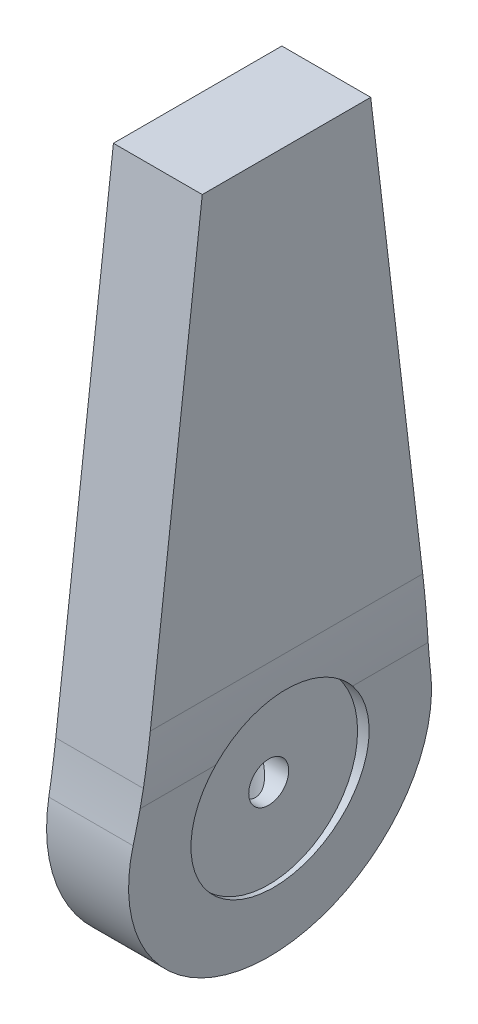
ISO-10303-21;
HEADER;
FILE_DESCRIPTION(('STEP AP214'),'2;1');
FILE_NAME('part.step','',(''),(''),'','','');
FILE_SCHEMA(('AUTOMOTIVE_DESIGN { 1 0 10303 214 1 1 1 1 }'));
ENDSEC;
DATA;
#1=APPLICATION_CONTEXT('core data for automotive mechanical design processes');
#2=APPLICATION_PROTOCOL_DEFINITION('international standard','automotive_design',2000,#1);
#3=PRODUCT_CONTEXT('',#1,'mechanical');
#4=PRODUCT('Part','Part','',(#3));
#5=PRODUCT_RELATED_PRODUCT_CATEGORY('part','',(#4));
#6=PRODUCT_DEFINITION_FORMATION('','',#4);
#7=PRODUCT_DEFINITION_CONTEXT('part definition',#1,'design');
#8=PRODUCT_DEFINITION('design','',#6,#7);
#9=PRODUCT_DEFINITION_SHAPE('','',#8);
#10=(LENGTH_UNIT() NAMED_UNIT(*) SI_UNIT(.MILLI.,.METRE.));
#11=(NAMED_UNIT(*) PLANE_ANGLE_UNIT() SI_UNIT($,.RADIAN.));
#12=(NAMED_UNIT(*) SI_UNIT($,.STERADIAN.) SOLID_ANGLE_UNIT());
#13=UNCERTAINTY_MEASURE_WITH_UNIT(LENGTH_MEASURE(1.E-05),#10,'distance_accuracy_value','');
#14=(GEOMETRIC_REPRESENTATION_CONTEXT(3) GLOBAL_UNCERTAINTY_ASSIGNED_CONTEXT((#13)) GLOBAL_UNIT_ASSIGNED_CONTEXT((#10,
#11,#12)) REPRESENTATION_CONTEXT('',''));
#15=CARTESIAN_POINT('',(0.,0.,0.));
#16=DIRECTION('',(0.,0.,1.));
#17=DIRECTION('',(1.,0.,0.));
#18=AXIS2_PLACEMENT_3D('',#15,#16,#17);
#19=CARTESIAN_POINT('',(-6.,-19.,0.));
#20=DIRECTION('',(0.,1.,0.));
#21=DIRECTION('',(0.,0.,1.));
#22=AXIS2_PLACEMENT_3D('',#19,#20,#21);
#23=CYLINDRICAL_SURFACE('',#22,2.5);
#24=CARTESIAN_POINT('',(-6.,-16.8151717208002,2.5));
#25=CARTESIAN_POINT('',(-6.13960906148192,-16.8151740185166,2.49999421020369));
#26=CARTESIAN_POINT('',(-6.27929995486534,-16.8169291988967,2.48826605121617));
#27=CARTESIAN_POINT('',(-6.55477842002669,-16.8237557916967,2.44167444753415));
#28=CARTESIAN_POINT('',(-6.69056201272335,-16.8288304679333,2.40678823272198));
#29=CARTESIAN_POINT('',(-6.95419839191177,-16.8417091295973,2.31494484226469));
#30=CARTESIAN_POINT('',(-7.08205709076528,-16.8495110507939,2.25800435581721));
#31=CARTESIAN_POINT('',(-7.3263864039983,-16.8669626686957,2.12370763056537));
#32=CARTESIAN_POINT('',(-7.44285863076834,-16.8766121032081,2.04635428809548));
#33=CARTESIAN_POINT('',(-7.66202434302888,-16.8967545847397,1.87279136125536));
#34=CARTESIAN_POINT('',(-7.76461744487372,-16.907252982425,1.77645562325415));
#35=CARTESIAN_POINT('',(-7.95224310302877,-16.9278626867034,1.56793485448318));
#36=CARTESIAN_POINT('',(-8.03727470583522,-16.9379739722539,1.45574896368403));
#37=CARTESIAN_POINT('',(-8.18773282906593,-16.9567260318457,1.2180707254503));
#38=CARTESIAN_POINT('',(-8.25306709238781,-16.9653598065303,1.09251937696103));
#39=CARTESIAN_POINT('',(-8.36168403912427,-16.9801248418252,0.832077202708479));
#40=CARTESIAN_POINT('',(-8.40496784342736,-16.9862562296358,0.697186852069652));
#41=CARTESIAN_POINT('',(-8.46795140200924,-16.995287909029,0.42292879699046));
#42=CARTESIAN_POINT('',(-8.48781913020422,-16.998211203127,0.283600437619453));
#43=CARTESIAN_POINT('',(-8.50392800954728,-17.0005761209487,0.00355891361205861));
#44=CARTESIAN_POINT('',(-8.50017042550937,-17.0000179310585,-0.137154176488152));
#45=CARTESIAN_POINT('',(-8.46926816315222,-16.9955011819606,-0.414825218535945));
#46=CARTESIAN_POINT('',(-8.44230419034891,-16.9915688971587,-0.551803769365082));
#47=CARTESIAN_POINT('',(-8.36603806027492,-16.9807750785218,-0.819270554274912));
#48=CARTESIAN_POINT('',(-8.31673534633206,-16.9739134716895,-0.949758626525637));
#49=CARTESIAN_POINT('',(-8.19700535761945,-16.9579867877463,-1.20108890904549));
#50=CARTESIAN_POINT('',(-8.12650174049244,-16.9489137703188,-1.32189422731169));
#51=CARTESIAN_POINT('',(-7.96642699469264,-16.9295759486806,-1.55002749324877));
#52=CARTESIAN_POINT('',(-7.8768546589482,-16.9193110690425,-1.65735458704856));
#53=CARTESIAN_POINT('',(-7.68017773851109,-16.8986202553189,-1.85654954239533));
#54=CARTESIAN_POINT('',(-7.57291541627695,-16.8881937160666,-1.94826166688123));
#55=CARTESIAN_POINT('',(-7.34443997041283,-16.8684495185282,-2.11240792664068));
#56=CARTESIAN_POINT('',(-7.22322676707911,-16.859131866578,-2.18484195176736));
#57=CARTESIAN_POINT('',(-6.97013102156376,-16.8426606437894,-2.30839536879655));
#58=CARTESIAN_POINT('',(-6.8382407747377,-16.8355086536737,-2.35949920197702));
#59=CARTESIAN_POINT('',(-6.56762086270222,-16.8242068379837,-2.43878726891991));
#60=CARTESIAN_POINT('',(-6.42889166055572,-16.8200568094451,-2.46697305219971));
#61=CARTESIAN_POINT('',(-6.149916176808,-16.8152671334742,-2.49941227314397));
#62=CARTESIAN_POINT('',(-6.00969607833697,-16.814595135128,-2.50388627546157));
#63=CARTESIAN_POINT('',(-5.73050810360339,-16.8167517589942,-2.48935977625441));
#64=CARTESIAN_POINT('',(-5.59154019016967,-16.8195802769464,-2.47035997387838));
#65=CARTESIAN_POINT('',(-5.31948185145494,-16.8283895386062,-2.4096120992047));
#66=CARTESIAN_POINT('',(-5.18636644275136,-16.8343551051417,-2.36797352162805));
#67=CARTESIAN_POINT('',(-4.92900467584743,-16.8487538078346,-2.2632438107387));
#68=CARTESIAN_POINT('',(-4.80475874029866,-16.8571870614857,-2.20015165593633));
#69=CARTESIAN_POINT('',(-4.56767291247191,-16.8756473049567,-2.05377424781224));
#70=CARTESIAN_POINT('',(-4.4549221974269,-16.8856854008258,-1.97034597978972));
#71=CARTESIAN_POINT('',(-4.24494324890917,-16.9061906654832,-1.78586380241483));
#72=CARTESIAN_POINT('',(-4.14771585857667,-16.9166578575388,-1.68480893630752));
#73=CARTESIAN_POINT('',(-3.97075356290693,-16.9369428195476,-1.46697176425955));
#74=CARTESIAN_POINT('',(-3.89116467429606,-16.9467547304722,-1.35007021425899));
#75=CARTESIAN_POINT('',(-3.75275504515444,-16.9645329982163,-1.10442863265448));
#76=CARTESIAN_POINT('',(-3.69393375457015,-16.9724994039141,-0.975688914711766));
#77=CARTESIAN_POINT('',(-3.59896334561044,-16.9856633523498,-0.71048502448538));
#78=CARTESIAN_POINT('',(-3.56273381717819,-16.9908707052188,-0.574050154778879));
#79=CARTESIAN_POINT('',(-3.51371493953207,-16.9979709468246,-0.296951082333415));
#80=CARTESIAN_POINT('',(-3.50092410489109,-16.999864045602,-0.1562871481857));
#81=CARTESIAN_POINT('',(-3.4991808769464,-17.0001205154926,0.123859733675883));
#82=CARTESIAN_POINT('',(-3.51000485162686,-16.9985169995871,0.263341311253438));
#83=CARTESIAN_POINT('',(-3.55470536808957,-16.9920270563139,0.538478359641031));
#84=CARTESIAN_POINT('',(-3.58858184436487,-16.9871406382752,0.67413384132232));
#85=CARTESIAN_POINT('',(-3.67834751559762,-16.9746313659072,0.937710544112775));
#86=CARTESIAN_POINT('',(-3.73422182052181,-16.9670103628902,1.06563692952141));
#87=CARTESIAN_POINT('',(-3.8663733542916,-16.9498698418753,1.31033385823192));
#88=CARTESIAN_POINT('',(-3.94265119358986,-16.9403502670763,1.42710406761065));
#89=CARTESIAN_POINT('',(-4.11425567496283,-16.9203641851463,1.64730939293222));
#90=CARTESIAN_POINT('',(-4.20974762724334,-16.9098899245386,1.75061499142791));
#91=CARTESIAN_POINT('',(-4.41672202128241,-16.8892329493587,1.93981763467728));
#92=CARTESIAN_POINT('',(-4.52820821371111,-16.8790503038444,2.0257105847098));
#93=CARTESIAN_POINT('',(-4.76471097908521,-16.8600707018513,2.17806321212975));
#94=CARTESIAN_POINT('',(-4.88979720701376,-16.8512815058354,2.24441570637191));
#95=CARTESIAN_POINT('',(-5.14940744936069,-16.8361748874922,2.35507140477779));
#96=CARTESIAN_POINT('',(-5.28392144107317,-16.8298548857848,2.39939763135067));
#97=CARTESIAN_POINT('',(-5.51587650215886,-16.8218718995573,2.45461211651069));
#98=CARTESIAN_POINT('',(-5.61188075286216,-16.8193725499681,2.47160673271683));
#99=CARTESIAN_POINT('',(-5.80524340379117,-16.8160216691373,2.49430262522055));
#100=CARTESIAN_POINT('',(-5.90260178748737,-16.8151701177992,2.50000403924935));
#101=CARTESIAN_POINT('',(-6.,-16.8151717208002,2.5));
#102=B_SPLINE_CURVE_WITH_KNOTS('',3,(#24,#25,#26,#27,#28,#29,#30,#31,#32,#33,#34,#35,#36,#37,
#38,#39,#40,#41,#42,#43,#44,#45,#46,#47,#48,#49,#50,#51,#52,#53,#54,#55,#56,#57,#58,#59,#60,#61,
#62,#63,#64,#65,#66,#67,#68,#69,#70,#71,#72,#73,#74,#75,#76,#77,#78,#79,#80,#81,#82,#83,#84,#85,
#86,#87,#88,#89,#90,#91,#92,#93,#94,#95,#96,#97,#98,#99,#100,#101),.UNSPECIFIED.,.T.,.F.,(4,2,2,
2,2,2,2,2,2,2,2,2,2,2,2,2,2,2,2,2,2,2,2,2,2,2,2,2,2,2,2,2,2,2,2,2,2,2,4),(0.,0.41847120810007,
0.837354487946605,1.25592140230922,1.67442895905137,2.09581782748951,2.51722956927747,
2.94058547780217,3.36391986377584,3.78419863489791,4.2044549060018,4.62146799605351,
5.03849147847009,5.45703497874756,5.87560498118832,6.29813197177102,6.72066137644184,
7.14349844722328,7.56630692709534,7.98517549166614,8.40403158086854,8.82087962186062,
9.23774751341641,9.65763620555363,10.0775476959446,10.5008152660655,10.9240716246206,
11.3458127718726,11.7675271903565,12.1852653255138,12.6030022736141,13.0204569460215,
13.4379241096387,13.8591496464984,14.2804741232455,14.7040683476293,15.1272188844489,
15.4191687358398,15.7111150266056),.UNSPECIFIED.);
#103=CARTESIAN_POINT('',(-6.,-16.8151717208002,2.5));
#104=VERTEX_POINT('',#103);
#105=EDGE_CURVE('E176',#104,#104,#102,.T.);
#106=ORIENTED_EDGE('',*,*,#105,.T.);
#107=EDGE_LOOP('',(#106));
#108=FACE_BOUND('',#107,.T.);
#109=CARTESIAN_POINT('',(-6.,-16.,0.));
#110=DIRECTION('',(0.,1.,0.));
#111=DIRECTION('',(0.,0.,1.));
#112=AXIS2_PLACEMENT_3D('',#109,#110,#111);
#113=CIRCLE('',#112,2.5);
#114=CARTESIAN_POINT('',(-6.,-16.,2.5));
#115=VERTEX_POINT('',#114);
#116=EDGE_CURVE('E51',#115,#115,#113,.F.);
#117=ORIENTED_EDGE('',*,*,#116,.F.);
#118=EDGE_LOOP('',(#117));
#119=FACE_BOUND('',#118,.T.);
#120=ADVANCED_FACE('F46',(#108,#119),#23,.F.);
#121=CARTESIAN_POINT('',(-10.,20.0618159527067,-115.267183277287));
#122=DIRECTION('',(1.,0.,0.));
#123=DIRECTION('',(0.,0.,-1.));
#124=AXIS2_PLACEMENT_3D('',#121,#122,#123);
#125=CYLINDRICAL_SURFACE('',#124,100.);
#126=DIRECTION('',(1.,0.,0.));
#127=VECTOR('',#126,1.);
#128=CARTESIAN_POINT('',(-10.,8.29110353174055,-15.9623479010433));
#129=LINE('',#128,#127);
#130=CARTESIAN_POINT('',(-10.,8.29110353174055,-15.9623479010433));
#131=VERTEX_POINT('',#130);
#132=CARTESIAN_POINT('',(-0.142704621186115,8.29110353174055,-15.9623479010433));
#133=VERTEX_POINT('',#132);
#134=EDGE_CURVE('E279',#131,#133,#129,.T.);
#135=ORIENTED_EDGE('',*,*,#134,.T.);
#136=CARTESIAN_POINT('',(-0.14270462118611,8.29110353174055,-15.9623479010433));
#137=CARTESIAN_POINT('',(-0.159792062425878,7.9716698806926,-16.0002126418456));
#138=CARTESIAN_POINT('',(-0.17839525662364,7.65252762071868,-16.0396028367243));
#139=CARTESIAN_POINT('',(-0.218633150935153,7.01482588291889,-16.1214341346341));
#140=CARTESIAN_POINT('',(-0.240267851048904,6.69626640509302,-16.1638752376652));
#141=CARTESIAN_POINT('',(-0.263418304120649,6.37799831834119,-16.2078417947727));
#142=B_SPLINE_CURVE_WITH_KNOTS('',3,(#136,#137,#138,#139,#140,#141),.UNSPECIFIED.,.F.,.F.,(4,2,
4),(0.,0.96630483569823,1.93260967139648),.UNSPECIFIED.);
#143=CARTESIAN_POINT('',(-0.263418304120647,6.37799831834123,-16.2078417947726));
#144=VERTEX_POINT('',#143);
#145=EDGE_CURVE('E75',#133,#144,#142,.T.);
#146=ORIENTED_EDGE('',*,*,#145,.T.);
#147=CARTESIAN_POINT('',(0.731768432924124,20.0618159527067,-115.267183277287));
#148=DIRECTION('',(0.997365816958794,-0.0725356957788214,0.));
#149=DIRECTION('',(0.0725356957788214,0.997365816958794,0.));
#150=AXIS2_PLACEMENT_3D('',#147,#148,#149);
#151=ELLIPSE('',#150,100.264114028816,100.);
#152=CARTESIAN_POINT('',(-0.515275293739853,2.91496471107704,-16.7482232112298));
#153=VERTEX_POINT('',#152);
#154=EDGE_CURVE('E245',#144,#153,#151,.T.);
#155=ORIENTED_EDGE('',*,*,#154,.T.);
#156=DIRECTION('',(1.,0.,0.));
#157=VECTOR('',#156,1.);
#158=CARTESIAN_POINT('',(-10.,2.91496471107704,-16.7482232112298));
#159=LINE('',#158,#157);
#160=CARTESIAN_POINT('',(-10.,2.91496471107704,-16.7482232112298));
#161=VERTEX_POINT('',#160);
#162=EDGE_CURVE('E275',#161,#153,#159,.T.);
#163=ORIENTED_EDGE('',*,*,#162,.F.);
#164=CARTESIAN_POINT('',(-10.,20.0618159527067,-115.267183277287));
#165=DIRECTION('',(-1.,0.,0.));
#166=DIRECTION('',(0.,0.,1.));
#167=AXIS2_PLACEMENT_3D('',#164,#165,#166);
#168=CIRCLE('',#167,100.);
#169=EDGE_CURVE('E301',#161,#131,#168,.T.);
#170=ORIENTED_EDGE('',*,*,#169,.T.);
#171=EDGE_LOOP('',(#135,#146,#155,#163,#170));
#172=FACE_BOUND('',#171,.T.);
#173=ADVANCED_FACE('F48',(#172),#125,.F.);
#174=CARTESIAN_POINT('',(-10.,0.,0.));
#175=DIRECTION('',(1.,0.,0.));
#176=DIRECTION('',(0.,0.,-1.));
#177=AXIS2_PLACEMENT_3D('',#174,#175,#176);
#178=CYLINDRICAL_SURFACE('',#177,17.);
#179=ORIENTED_EDGE('',*,*,#105,.F.);
#180=EDGE_LOOP('',(#179));
#181=FACE_BOUND('',#180,.T.);
#182=CARTESIAN_POINT('',(-10.,0.,0.));
#183=DIRECTION('',(1.,0.,0.));
#184=DIRECTION('',(0.,0.,-1.));
#185=AXIS2_PLACEMENT_3D('',#182,#183,#184);
#186=CIRCLE('',#185,17.);
#187=CARTESIAN_POINT('',(-10.,2.91496471107704,16.7482232112298));
#188=VERTEX_POINT('',#187);
#189=EDGE_CURVE('E283',#188,#161,#186,.T.);
#190=ORIENTED_EDGE('',*,*,#189,.T.);
#191=ORIENTED_EDGE('',*,*,#162,.T.);
#192=CARTESIAN_POINT('',(-0.727272727272727,0.,0.));
#193=DIRECTION('',(0.997365816958794,-0.0725356957788214,0.));
#194=DIRECTION('',(0.0725356957788214,0.997365816958794,0.));
#195=AXIS2_PLACEMENT_3D('',#192,#193,#194);
#196=ELLIPSE('',#195,17.0448993848988,17.);
#197=CARTESIAN_POINT('',(-0.515275293739851,2.91496471107704,16.7482232112298));
#198=VERTEX_POINT('',#197);
#199=EDGE_CURVE('E246',#153,#198,#196,.F.);
#200=ORIENTED_EDGE('',*,*,#199,.T.);
#201=DIRECTION('',(1.,0.,0.));
#202=VECTOR('',#201,1.);
#203=CARTESIAN_POINT('',(-10.,2.91496471107704,16.7482232112298));
#204=LINE('',#203,#202);
#205=EDGE_CURVE('E273',#188,#198,#204,.T.);
#206=ORIENTED_EDGE('',*,*,#205,.F.);
#207=EDGE_LOOP('',(#190,#191,#200,#206));
#208=FACE_BOUND('',#207,.T.);
#209=ADVANCED_FACE('F189',(#181,#208),#178,.T.);
#210=CARTESIAN_POINT('',(-10.,20.0618159527067,115.267183277287));
#211=DIRECTION('',(1.,0.,0.));
#212=DIRECTION('',(0.,0.,-1.));
#213=AXIS2_PLACEMENT_3D('',#210,#211,#212);
#214=CYLINDRICAL_SURFACE('',#213,100.);
#215=CARTESIAN_POINT('',(0.731768432924124,20.0618159527067,115.267183277287));
#216=DIRECTION('',(0.997365816958794,-0.0725356957788214,0.));
#217=DIRECTION('',(0.0725356957788214,0.997365816958794,0.));
#218=AXIS2_PLACEMENT_3D('',#215,#216,#217);
#219=ELLIPSE('',#218,100.264114028816,100.);
#220=CARTESIAN_POINT('',(-0.263418304120647,6.37799831834123,16.2078417947726));
#221=VERTEX_POINT('',#220);
#222=EDGE_CURVE('E248',#198,#221,#219,.T.);
#223=ORIENTED_EDGE('',*,*,#222,.T.);
#224=CARTESIAN_POINT('',(-0.263418304120647,6.37799831834119,16.2078417947727));
#225=CARTESIAN_POINT('',(-0.240267851048906,6.69626640509291,16.1638752376652));
#226=CARTESIAN_POINT('',(-0.21863315093516,7.01482588291867,16.1214341346341));
#227=CARTESIAN_POINT('',(-0.178395256623656,7.65252762071824,16.0396028367243));
#228=CARTESIAN_POINT('',(-0.159792062425899,7.97166988069205,16.0002126418457));
#229=CARTESIAN_POINT('',(-0.142704621186135,8.2911035317399,15.9623479010433));
#230=B_SPLINE_CURVE_WITH_KNOTS('',3,(#224,#225,#226,#227,#228,#229),.UNSPECIFIED.,.F.,.F.,(4,2,
4),(0.,0.966304835697922,1.93260967139582),.UNSPECIFIED.);
#231=CARTESIAN_POINT('',(-0.142704621186143,8.2911035317399,15.9623479010433));
#232=VERTEX_POINT('',#231);
#233=EDGE_CURVE('E202',#221,#232,#230,.T.);
#234=ORIENTED_EDGE('',*,*,#233,.T.);
#235=DIRECTION('',(1.,0.,0.));
#236=VECTOR('',#235,1.);
#237=CARTESIAN_POINT('',(-10.,8.2911035317399,15.9623479010433));
#238=LINE('',#237,#236);
#239=CARTESIAN_POINT('',(-10.,8.2911035317399,15.9623479010433));
#240=VERTEX_POINT('',#239);
#241=EDGE_CURVE('E289',#240,#232,#238,.T.);
#242=ORIENTED_EDGE('',*,*,#241,.F.);
#243=CARTESIAN_POINT('',(-10.,20.0618159527067,115.267183277287));
#244=DIRECTION('',(-1.,0.,0.));
#245=DIRECTION('',(0.,0.,-1.));
#246=AXIS2_PLACEMENT_3D('',#243,#244,#245);
#247=CIRCLE('',#246,100.);
#248=EDGE_CURVE('E311',#240,#188,#247,.T.);
#249=ORIENTED_EDGE('',*,*,#248,.T.);
#250=ORIENTED_EDGE('',*,*,#205,.T.);
#251=EDGE_LOOP('',(#223,#234,#242,#249,#250));
#252=FACE_BOUND('',#251,.T.);
#253=ADVANCED_FACE('F194',(#252),#214,.F.);
#254=CARTESIAN_POINT('',(-10.,8.29110353173989,15.9623479010433));
#255=DIRECTION('',(0.,0.117707124209665,0.993048353762439));
#256=DIRECTION('',(0.,-0.993048353762439,0.117707124209665));
#257=AXIS2_PLACEMENT_3D('',#254,#255,#256);
#258=PLANE('',#257);
#259=ORIENTED_EDGE('',*,*,#241,.T.);
#260=CARTESIAN_POINT('',(-100.,13.6315678962238,15.3293367290234));
#261=DIRECTION('',(0.,0.117707124209665,0.993048353762439));
#262=DIRECTION('',(0.,-0.993048353762439,0.117707124209665));
#263=AXIS2_PLACEMENT_3D('',#260,#261,#262);
#264=ELLIPSE('',#263,100.700030991565,100.);
#265=CARTESIAN_POINT('',(0.,13.631567896224,15.3293367290234));
#266=VERTEX_POINT('',#265);
#267=EDGE_CURVE('E213',#232,#266,#264,.T.);
#268=ORIENTED_EDGE('',*,*,#267,.T.);
#269=DIRECTION('',(0.,-0.993048353762439,0.117707124209665));
#270=VECTOR('',#269,1.);
#271=CARTESIAN_POINT('',(0.,8.29110353173989,15.9623479010433));
#272=LINE('',#271,#270);
#273=CARTESIAN_POINT('',(0.,63.,9.47764164523525));
#274=VERTEX_POINT('',#273);
#275=EDGE_CURVE('E300',#274,#266,#272,.T.);
#276=ORIENTED_EDGE('',*,*,#275,.F.);
#277=DIRECTION('',(1.,0.,0.));
#278=VECTOR('',#277,1.);
#279=CARTESIAN_POINT('',(-10.,63.,9.47764164523525));
#280=LINE('',#279,#278);
#281=CARTESIAN_POINT('',(-10.,63.,9.47764164523525));
#282=VERTEX_POINT('',#281);
#283=EDGE_CURVE('E290',#282,#274,#280,.T.);
#284=ORIENTED_EDGE('',*,*,#283,.F.);
#285=DIRECTION('',(0.,-0.993048353762439,0.117707124209665));
#286=VECTOR('',#285,1.);
#287=CARTESIAN_POINT('',(-10.,8.29110353173989,15.9623479010433));
#288=LINE('',#287,#286);
#289=EDGE_CURVE('E314',#282,#240,#288,.T.);
#290=ORIENTED_EDGE('',*,*,#289,.T.);
#291=EDGE_LOOP('',(#259,#268,#276,#284,#290));
#292=FACE_BOUND('',#291,.T.);
#293=ADVANCED_FACE('F199',(#292),#258,.T.);
#294=CARTESIAN_POINT('',(-10.,8.29110353174055,-15.9623479010433));
#295=DIRECTION('',(0.,0.117707124209668,-0.993048353762439));
#296=DIRECTION('',(0.,0.993048353762439,0.117707124209668));
#297=AXIS2_PLACEMENT_3D('',#294,#295,#296);
#298=PLANE('',#297);
#299=DIRECTION('',(0.,0.993048353762439,0.117707124209668));
#300=VECTOR('',#299,1.);
#301=CARTESIAN_POINT('',(0.,8.29110353174055,-15.9623479010433));
#302=LINE('',#301,#300);
#303=CARTESIAN_POINT('',(0.,13.631567896224,-15.3293367290234));
#304=VERTEX_POINT('',#303);
#305=CARTESIAN_POINT('',(0.,63.,-9.47764164523512));
#306=VERTEX_POINT('',#305);
#307=EDGE_CURVE('E306',#304,#306,#302,.T.);
#308=ORIENTED_EDGE('',*,*,#307,.F.);
#309=CARTESIAN_POINT('',(-100.,13.6315678962238,-15.3293367290234));
#310=DIRECTION('',(0.,0.117707124209668,-0.993048353762439));
#311=DIRECTION('',(0.,0.993048353762439,0.117707124209668));
#312=AXIS2_PLACEMENT_3D('',#309,#310,#311);
#313=ELLIPSE('',#312,100.700030991565,100.);
#314=EDGE_CURVE('E237',#304,#133,#313,.T.);
#315=ORIENTED_EDGE('',*,*,#314,.T.);
#316=ORIENTED_EDGE('',*,*,#134,.F.);
#317=DIRECTION('',(0.,0.993048353762439,0.117707124209668));
#318=VECTOR('',#317,1.);
#319=CARTESIAN_POINT('',(-10.,8.29110353174055,-15.9623479010433));
#320=LINE('',#319,#318);
#321=CARTESIAN_POINT('',(-10.,63.,-9.47764164523512));
#322=VERTEX_POINT('',#321);
#323=EDGE_CURVE('E324',#131,#322,#320,.T.);
#324=ORIENTED_EDGE('',*,*,#323,.T.);
#325=DIRECTION('',(1.,0.,0.));
#326=VECTOR('',#325,1.);
#327=CARTESIAN_POINT('',(-10.,63.,-9.47764164523512));
#328=LINE('',#327,#326);
#329=EDGE_CURVE('E285',#322,#306,#328,.T.);
#330=ORIENTED_EDGE('',*,*,#329,.T.);
#331=EDGE_LOOP('',(#308,#315,#316,#324,#330));
#332=FACE_BOUND('',#331,.T.);
#333=ADVANCED_FACE('F339',(#332),#298,.T.);
#334=CARTESIAN_POINT('',(0.,20.0618159527067,-115.267183277287));
#335=DIRECTION('',(-1.,0.,0.));
#336=DIRECTION('',(0.,0.,1.));
#337=AXIS2_PLACEMENT_3D('',#334,#335,#336);
#338=PLANE('',#337);
#339=DIRECTION('',(0.,0.,1.));
#340=VECTOR('',#339,1.);
#341=CARTESIAN_POINT('',(0.,13.631567896224,-17.));
#342=LINE('',#341,#340);
#343=EDGE_CURVE('E254',#304,#266,#342,.T.);
#344=ORIENTED_EDGE('',*,*,#343,.F.);
#345=ORIENTED_EDGE('',*,*,#307,.T.);
#346=DIRECTION('',(0.,0.,1.));
#347=VECTOR('',#346,1.);
#348=CARTESIAN_POINT('',(0.,63.,9.47764164523525));
#349=LINE('',#348,#347);
#350=EDGE_CURVE('E305',#306,#274,#349,.T.);
#351=ORIENTED_EDGE('',*,*,#350,.T.);
#352=ORIENTED_EDGE('',*,*,#275,.T.);
#353=EDGE_LOOP('',(#344,#345,#351,#352));
#354=FACE_BOUND('',#353,.T.);
#355=ADVANCED_FACE('F195',(#354),#338,.F.);
#356=CARTESIAN_POINT('',(-10.,63.,9.47764164523525));
#357=DIRECTION('',(0.,1.,0.));
#358=DIRECTION('',(0.,0.,1.));
#359=AXIS2_PLACEMENT_3D('',#356,#357,#358);
#360=PLANE('',#359);
#361=ORIENTED_EDGE('',*,*,#350,.F.);
#362=ORIENTED_EDGE('',*,*,#329,.F.);
#363=DIRECTION('',(0.,0.,1.));
#364=VECTOR('',#363,1.);
#365=CARTESIAN_POINT('',(-10.,63.,9.47764164523525));
#366=LINE('',#365,#364);
#367=EDGE_CURVE('E316',#322,#282,#366,.T.);
#368=ORIENTED_EDGE('',*,*,#367,.T.);
#369=ORIENTED_EDGE('',*,*,#283,.T.);
#370=EDGE_LOOP('',(#361,#362,#368,#369));
#371=FACE_BOUND('',#370,.T.);
#372=ADVANCED_FACE('F420',(#371),#360,.T.);
#373=CARTESIAN_POINT('',(-10.,20.0618159527067,-115.267183277287));
#374=DIRECTION('',(-1.,0.,0.));
#375=DIRECTION('',(0.,0.,1.));
#376=AXIS2_PLACEMENT_3D('',#373,#374,#375);
#377=PLANE('',#376);
#378=CARTESIAN_POINT('',(-10.,0.,0.));
#379=DIRECTION('',(-1.,0.,0.));
#380=DIRECTION('',(0.,0.,1.));
#381=AXIS2_PLACEMENT_3D('',#378,#379,#380);
#382=CIRCLE('',#381,2.25);
#383=CARTESIAN_POINT('',(-10.,0.,2.25));
#384=VERTEX_POINT('',#383);
#385=EDGE_CURVE('E187',#384,#384,#382,.F.);
#386=ORIENTED_EDGE('',*,*,#385,.T.);
#387=EDGE_LOOP('',(#386));
#388=FACE_BOUND('',#387,.T.);
#389=ORIENTED_EDGE('',*,*,#169,.F.);
#390=ORIENTED_EDGE('',*,*,#189,.F.);
#391=ORIENTED_EDGE('',*,*,#248,.F.);
#392=ORIENTED_EDGE('',*,*,#289,.F.);
#393=ORIENTED_EDGE('',*,*,#367,.F.);
#394=ORIENTED_EDGE('',*,*,#323,.F.);
#395=EDGE_LOOP('',(#389,#390,#391,#392,#393,#394));
#396=FACE_BOUND('',#395,.T.);
#397=ADVANCED_FACE('F225',(#388,#396),#377,.T.);
#398=CARTESIAN_POINT('',(-100.,13.6315678962238,-17.));
#399=DIRECTION('',(0.,0.,1.));
#400=DIRECTION('',(1.,0.,0.));
#401=AXIS2_PLACEMENT_3D('',#398,#399,#400);
#402=CYLINDRICAL_SURFACE('',#401,100.);
#403=DIRECTION('',(0.,0.,1.));
#404=VECTOR('',#403,1.);
#405=CARTESIAN_POINT('',(-0.263418304120647,6.37799831834123,-17.));
#406=LINE('',#405,#404);
#407=CARTESIAN_POINT('',(-0.263418304120647,6.37799831834123,7.70202164702466));
#408=VERTEX_POINT('',#407);
#409=EDGE_CURVE('E251',#408,#221,#406,.T.);
#410=ORIENTED_EDGE('',*,*,#409,.F.);
#411=CARTESIAN_POINT('',(-0.263418304120647,6.37799831834119,7.7020216470247));
#412=CARTESIAN_POINT('',(-0.247713816559626,6.59391171732562,7.52326609925007));
#413=CARTESIAN_POINT('',(-0.233263570797488,6.80231913727797,7.33534352399743));
#414=CARTESIAN_POINT('',(-0.206665012576342,7.20269098479594,6.94260070825067));
#415=CARTESIAN_POINT('',(-0.19451657583562,7.3946562998143,6.73778138092151));
#416=CARTESIAN_POINT('',(-0.172321745598399,7.7605994891075,6.31282097866942));
#417=CARTESIAN_POINT('',(-0.162273785101091,7.93459072306499,6.09269149003216));
#418=CARTESIAN_POINT('',(-0.144049005696933,8.2634972752613,5.63854651790007));
#419=CARTESIAN_POINT('',(-0.135872165796322,8.41841280751832,5.40453119023987));
#420=CARTESIAN_POINT('',(-0.121169979905781,8.70811666764552,4.9241661213629));
#421=CARTESIAN_POINT('',(-0.114645367815688,8.84289604041393,4.67781095693034));
#422=CARTESIAN_POINT('',(-0.103046955428743,9.0912773570104,4.1746138267725));
#423=CARTESIAN_POINT('',(-0.0979731567273272,9.20487927754991,3.91777184951539));
#424=CARTESIAN_POINT('',(-0.0890919964580308,9.41007359013786,3.39547159891291));
#425=CARTESIAN_POINT('',(-0.0852844172632655,9.50166976359233,3.13001481482336));
#426=CARTESIAN_POINT('',(-0.0787772239616564,9.66222283765891,2.59232914265671));
#427=CARTESIAN_POINT('',(-0.0760776052599315,9.73117983215892,2.3201002826694));
#428=CARTESIAN_POINT('',(-0.0716616287613758,9.84600340151459,1.77060829579237));
#429=CARTESIAN_POINT('',(-0.0699459624187584,9.89185373585743,1.49334176959343));
#430=CARTESIAN_POINT('',(-0.0674165883199542,9.96006408471178,0.935929488493604));
#431=CARTESIAN_POINT('',(-0.0666028829353052,9.98242403745972,0.655783726024267));
#432=CARTESIAN_POINT('',(-0.0658356814251077,10.0034948454093,0.0945804574781285));
#433=CARTESIAN_POINT('',(-0.0658822545386687,10.0022037970714,-0.186477120165514));
#434=CARTESIAN_POINT('',(-0.0668381988330191,9.97597718207239,-0.747484744461392));
#435=CARTESIAN_POINT('',(-0.0677475679142209,9.95104167294937,-1.0274347938071));
#436=CARTESIAN_POINT('',(-0.0704759984767502,9.87769294654507,-1.58432388509299));
#437=CARTESIAN_POINT('',(-0.0722953347616108,9.82927263715731,-1.86126199161893));
#438=CARTESIAN_POINT('',(-0.0769326926098872,9.7092957264579,-2.4100781142926));
#439=CARTESIAN_POINT('',(-0.0797507354490336,9.63773863225958,-2.68195602251161));
#440=CARTESIAN_POINT('',(-0.0865142825158434,9.47197069276748,-3.21880744698652));
#441=CARTESIAN_POINT('',(-0.0904601874434314,9.3777517982174,-3.48377847283513));
#442=CARTESIAN_POINT('',(-0.0996403291863875,9.16735276871576,-4.00481929988957));
#443=CARTESIAN_POINT('',(-0.104874520191637,9.05117341468947,-4.26088941723307));
#444=CARTESIAN_POINT('',(-0.116822880779141,8.79762168676931,-4.76244219856025));
#445=CARTESIAN_POINT('',(-0.123537810478325,8.66023843905606,-5.00791934712114));
#446=CARTESIAN_POINT('',(-0.138654260384059,8.36531542801857,-5.48638937331153));
#447=CARTESIAN_POINT('',(-0.147055727302593,8.20777630159872,-5.71938264508839));
#448=CARTESIAN_POINT('',(-0.165748568865294,7.87395206504473,-6.17086600220883));
#449=CARTESIAN_POINT('',(-0.176036948590755,7.69769684525855,-6.38937833394602));
#450=CARTESIAN_POINT('',(-0.198727247356432,7.32757842226054,-6.81066345367317));
#451=CARTESIAN_POINT('',(-0.211127970734259,7.13372520897966,-7.0134450518352));
#452=CARTESIAN_POINT('',(-0.230681952861993,6.84251854291778,-7.29351095589909));
#453=CARTESIAN_POINT('',(-0.236903556775161,6.75165762622441,-7.37770027119613));
#454=CARTESIAN_POINT('',(-0.249808751679305,6.56701566083032,-7.5425189604086));
#455=CARTESIAN_POINT('',(-0.256491705838307,6.47323873187284,-7.6231529994105));
#456=CARTESIAN_POINT('',(-0.263418304120651,6.37799831834119,-7.7020216470247));
#457=B_SPLINE_CURVE_WITH_KNOTS('',3,(#411,#412,#413,#414,#415,#416,#417,#418,#419,#420,#421,
#422,#423,#424,#425,#426,#427,#428,#429,#430,#431,#432,#433,#434,#435,#436,#437,#438,#439,#440,
#441,#442,#443,#444,#445,#446,#447,#448,#449,#450,#451,#452,#453,#454,#455,#456),.UNSPECIFIED.,
.F.,.F.,(4,2,2,2,2,2,2,2,2,2,2,2,2,2,2,2,2,2,2,2,2,2,4),(0.,0.841982453661677,1.68391943315042,
2.52522605003509,3.36652322709278,4.20819344538228,5.04986458923909,5.8913909990675,
6.7329139189224,7.57502748101991,8.41714325729236,9.25932681115141,10.1015083155878,
10.9439443064669,11.7863982450794,12.6291518583719,13.4718755085472,14.3150327706134,
15.1581633963809,15.9999672031365,16.8412960925091,17.2133004620552,17.5848012190239),.UNSPECIFIED.);
#458=CARTESIAN_POINT('',(-0.263418304120647,6.37799831834123,-7.70202164702466));
#459=VERTEX_POINT('',#458);
#460=EDGE_CURVE('E138',#408,#459,#457,.T.);
#461=ORIENTED_EDGE('',*,*,#460,.T.);
#462=EDGE_CURVE('E257',#144,#459,#406,.T.);
#463=ORIENTED_EDGE('',*,*,#462,.F.);
#464=ORIENTED_EDGE('',*,*,#145,.F.);
#465=ORIENTED_EDGE('',*,*,#314,.F.);
#466=ORIENTED_EDGE('',*,*,#343,.T.);
#467=ORIENTED_EDGE('',*,*,#267,.F.);
#468=ORIENTED_EDGE('',*,*,#233,.F.);
#469=EDGE_LOOP('',(#410,#461,#463,#464,#465,#466,#467,#468));
#470=FACE_BOUND('',#469,.T.);
#471=ADVANCED_FACE('F220',(#470),#402,.T.);
#472=CARTESIAN_POINT('',(-0.26341830412064,6.3779983183412,-17.));
#473=DIRECTION('',(0.997365816958794,-0.0725356957788214,0.));
#474=DIRECTION('',(0.0725356957788214,0.997365816958794,0.));
#475=AXIS2_PLACEMENT_3D('',#472,#473,#474);
#476=PLANE('',#475);
#477=ORIENTED_EDGE('',*,*,#462,.T.);
#478=CARTESIAN_POINT('',(-0.727272727272727,0.,0.));
#479=DIRECTION('',(0.997365816958794,-0.0725356957788214,0.));
#480=DIRECTION('',(0.0725356957788214,0.997365816958794,0.));
#481=AXIS2_PLACEMENT_3D('',#478,#479,#480);
#482=ELLIPSE('',#481,10.0264114028816,10.);
#483=EDGE_CURVE('E264',#459,#408,#482,.F.);
#484=ORIENTED_EDGE('',*,*,#483,.T.);
#485=ORIENTED_EDGE('',*,*,#409,.T.);
#486=ORIENTED_EDGE('',*,*,#222,.F.);
#487=ORIENTED_EDGE('',*,*,#199,.F.);
#488=ORIENTED_EDGE('',*,*,#154,.F.);
#489=EDGE_LOOP('',(#477,#484,#485,#486,#487,#488));
#490=FACE_BOUND('',#489,.T.);
#491=ADVANCED_FACE('F221',(#490),#476,.T.);
#492=CARTESIAN_POINT('',(-2.,0.,0.));
#493=DIRECTION('',(1.,0.,0.));
#494=DIRECTION('',(0.,0.,-1.));
#495=AXIS2_PLACEMENT_3D('',#492,#493,#494);
#496=PLANE('',#495);
#497=CARTESIAN_POINT('',(-2.,0.,0.));
#498=DIRECTION('',(1.,0.,0.));
#499=DIRECTION('',(0.,0.,-1.));
#500=AXIS2_PLACEMENT_3D('',#497,#498,#499);
#501=CIRCLE('',#500,2.25);
#502=CARTESIAN_POINT('',(-2.,0.,-2.25));
#503=VERTEX_POINT('',#502);
#504=EDGE_CURVE('E183',#503,#503,#501,.F.);
#505=ORIENTED_EDGE('',*,*,#504,.T.);
#506=EDGE_LOOP('',(#505));
#507=FACE_BOUND('',#506,.T.);
#508=CARTESIAN_POINT('',(-2.,0.,0.));
#509=DIRECTION('',(1.,0.,0.));
#510=DIRECTION('',(0.,0.,-1.));
#511=AXIS2_PLACEMENT_3D('',#508,#509,#510);
#512=CIRCLE('',#511,10.);
#513=CARTESIAN_POINT('',(-2.,0.,-10.));
#514=VERTEX_POINT('',#513);
#515=EDGE_CURVE('E214',#514,#514,#512,.T.);
#516=ORIENTED_EDGE('',*,*,#515,.T.);
#517=EDGE_LOOP('',(#516));
#518=FACE_BOUND('',#517,.T.);
#519=ADVANCED_FACE('F347',(#507,#518),#496,.T.);
#520=CARTESIAN_POINT('',(-2.,0.,0.));
#521=DIRECTION('',(1.,0.,0.));
#522=DIRECTION('',(0.,0.,-1.));
#523=AXIS2_PLACEMENT_3D('',#520,#521,#522);
#524=CYLINDRICAL_SURFACE('',#523,10.);
#525=ORIENTED_EDGE('',*,*,#515,.F.);
#526=EDGE_LOOP('',(#525));
#527=FACE_BOUND('',#526,.T.);
#528=ORIENTED_EDGE('',*,*,#460,.F.);
#529=ORIENTED_EDGE('',*,*,#483,.F.);
#530=EDGE_LOOP('',(#528,#529));
#531=FACE_BOUND('',#530,.T.);
#532=ADVANCED_FACE('F269',(#527,#531),#524,.F.);
#533=CARTESIAN_POINT('',(0.,0.,0.));
#534=DIRECTION('',(-1.,0.,0.));
#535=DIRECTION('',(0.,0.,1.));
#536=AXIS2_PLACEMENT_3D('',#533,#534,#535);
#537=CYLINDRICAL_SURFACE('',#536,2.25);
#538=DIRECTION('',(-1.,0.,0.));
#539=VECTOR('',#538,1.);
#540=CARTESIAN_POINT('',(0.,0.,-2.25));
#541=LINE('',#540,#539);
#542=CARTESIAN_POINT('',(-4.91027526411483,0.,-2.25));
#543=VERTEX_POINT('',#542);
#544=CARTESIAN_POINT('',(-7.08972473588517,0.,-2.25));
#545=VERTEX_POINT('',#544);
#546=EDGE_CURVE('E12',#543,#545,#541,.T.);
#547=ORIENTED_EDGE('',*,*,#546,.F.);
#548=CARTESIAN_POINT('',(-4.91027526411483,0.,2.25));
#549=CARTESIAN_POINT('',(-4.91030369381589,-0.0341859508080648,2.25000675759086));
#550=CARTESIAN_POINT('',(-4.90866507276925,-0.0683415633458057,2.24922059512591));
#551=CARTESIAN_POINT('',(-4.90230783988943,-0.136205923719966,2.24612815346698));
#552=CARTESIAN_POINT('',(-4.89759755124645,-0.169915628694688,2.24382598198479));
#553=CARTESIAN_POINT('',(-4.8794523937608,-0.268832117592413,2.23484985720516));
#554=CARTESIAN_POINT('',(-4.86198383415322,-0.333118492903184,2.22610082346332));
#555=CARTESIAN_POINT('',(-4.80889865392919,-0.488884888474268,2.19830021223782));
#556=CARTESIAN_POINT('',(-4.76858048793306,-0.57813610592102,2.17629543793941));
#557=CARTESIAN_POINT('',(-4.67909499497234,-0.750156351578109,2.12319759773634));
#558=CARTESIAN_POINT('',(-4.62983330292045,-0.83284125037565,2.09200516571976));
#559=CARTESIAN_POINT('',(-4.53506788219317,-0.980409382398703,2.02652513364072));
#560=CARTESIAN_POINT('',(-4.49006981423955,-1.04612659572229,1.99335921540598));
#561=CARTESIAN_POINT('',(-4.39912710273981,-1.17357965122127,1.92108891701629));
#562=CARTESIAN_POINT('',(-4.3531818889277,-1.23531299655407,1.88198086321958));
#563=CARTESIAN_POINT('',(-4.26183374232393,-1.3546907174701,1.79794859934494));
#564=CARTESIAN_POINT('',(-4.21642950149706,-1.41234820885129,1.75304449523537));
#565=CARTESIAN_POINT('',(-4.12706148651287,-1.52364534585048,1.65722555976445));
#566=CARTESIAN_POINT('',(-4.08309780125792,-1.57728474375784,1.6063103583238));
#567=CARTESIAN_POINT('',(-3.97554840287013,-1.70669039636798,1.47053612685858));
#568=CARTESIAN_POINT('',(-3.91350253075012,-1.77964494273807,1.38168914262399));
#569=CARTESIAN_POINT('',(-3.79850913157521,-1.91316483015156,1.18991659947177));
#570=CARTESIAN_POINT('',(-3.74554920936269,-1.97374707147887,1.08701057016213));
#571=CARTESIAN_POINT('',(-3.66166560063356,-2.06898732575461,0.889569128257654));
#572=CARTESIAN_POINT('',(-3.62845733701422,-2.10639913157007,0.797345894089236));
#573=CARTESIAN_POINT('',(-3.57248113711819,-2.16922848653002,0.605867739170681));
#574=CARTESIAN_POINT('',(-3.54970634182878,-2.19465391589713,0.506617487714575));
#575=CARTESIAN_POINT('',(-3.51626463257026,-2.23192969167852,0.302924244696666));
#576=CARTESIAN_POINT('',(-3.50567121203864,-2.24369764284371,0.198453661217221));
#577=CARTESIAN_POINT('',(-3.49782148515972,-2.25242126421626,-0.0115986867945178));
#578=CARTESIAN_POINT('',(-3.50056091846984,-2.24938166598598,-0.117180085620997));
#579=CARTESIAN_POINT('',(-3.51818818704624,-2.22977685094674,-0.315530111824223));
#580=CARTESIAN_POINT('',(-3.53186996238378,-2.21455432224771,-0.408547017319872));
#581=CARTESIAN_POINT('',(-3.56887628509168,-2.17323411056728,-0.590108414434421));
#582=CARTESIAN_POINT('',(-3.59220295422475,-2.14713403464394,-0.678651917144854));
#583=CARTESIAN_POINT('',(-3.6485922755602,-2.08370876946596,-0.854317390358452));
#584=CARTESIAN_POINT('',(-3.68212064842431,-2.04584421402862,-0.94109207817312));
#585=CARTESIAN_POINT('',(-3.75646959832594,-1.96120693842288,-1.10672165254985));
#586=CARTESIAN_POINT('',(-3.7972924635091,-1.91443142274775,-1.18557404187506));
#587=CARTESIAN_POINT('',(-3.9074592413424,-1.78683337943369,-1.37428699366613));
#588=CARTESIAN_POINT('',(-3.98051775561971,-1.70103617993816,-1.47866737249422));
#589=CARTESIAN_POINT('',(-4.09553435943501,-1.56209998649154,-1.62072969424257));
#590=CARTESIAN_POINT('',(-4.13487925487548,-1.51395295458513,-1.66575643894925));
#591=CARTESIAN_POINT('',(-4.21469430752666,-1.41446183372706,-1.75102374592839));
#592=CARTESIAN_POINT('',(-4.2551640368906,-1.36311895139644,-1.79126609808961));
#593=CARTESIAN_POINT('',(-4.33745629887829,-1.25608645513458,-1.86793677460914));
#594=CARTESIAN_POINT('',(-4.37928798728559,-1.20032209017548,-1.90425037363993));
#595=CARTESIAN_POINT('',(-4.46242736121822,-1.08545172721542,-1.97198982253755));
#596=CARTESIAN_POINT('',(-4.50373469330909,-1.02634360809788,-2.00341252135489));
#597=CARTESIAN_POINT('',(-4.58438718636001,-0.904727122082141,-2.06118658032985));
#598=CARTESIAN_POINT('',(-4.62373830332954,-0.842230464433394,-2.08755413430114));
#599=CARTESIAN_POINT('',(-4.69869315489204,-0.713203007158031,-2.13507854308408));
#600=CARTESIAN_POINT('',(-4.73430256894112,-0.64667857043963,-2.15624336240287));
#601=CARTESIAN_POINT('',(-4.79511466602128,-0.516862761404905,-2.19073707755845));
#602=CARTESIAN_POINT('',(-4.82104466786348,-0.45408754427388,-2.20468919266127));
#603=CARTESIAN_POINT('',(-4.86444714310534,-0.324981630726175,-2.22735905979557));
#604=CARTESIAN_POINT('',(-4.88196860710825,-0.258674093579608,-2.23610720504554));
#605=CARTESIAN_POINT('',(-4.89906632439549,-0.159733841369565,-2.24454484255655));
#606=CARTESIAN_POINT('',(-4.90322802638042,-0.128071278982301,-2.24657671679653));
#607=CARTESIAN_POINT('',(-4.90885063853802,-0.0642823254224357,-2.24931031113098));
#608=CARTESIAN_POINT('',(-4.91029702056179,-0.0321543608655745,-2.25000487654213));
#609=CARTESIAN_POINT('',(-4.91027526411483,0.,-2.25));
#610=B_SPLINE_CURVE_WITH_KNOTS('',3,(#548,#549,#550,#551,#552,#553,#554,#555,#556,#557,#558,
#559,#560,#561,#562,#563,#564,#565,#566,#567,#568,#569,#570,#571,#572,#573,#574,#575,#576,#577,
#578,#579,#580,#581,#582,#583,#584,#585,#586,#587,#588,#589,#590,#591,#592,#593,#594,#595,#596,
#597,#598,#599,#600,#601,#602,#603,#604,#605,#606,#607,#608,#609),.UNSPECIFIED.,.F.,.F.,(4,2,2,
2,2,2,2,2,2,2,2,2,2,2,2,2,2,2,2,2,2,2,2,2,2,2,2,2,2,2,4),(0.,0.102458236090026,
0.204639991854472,0.405194526570871,0.70468076960662,1.00753302001598,1.26604762473171,
1.52472270770857,1.78252344448339,2.04034006130665,2.4307805405789,2.820684066289,
3.13417160807566,3.44745276484224,3.76261427292656,4.0776750818026,4.3621280418906,
4.64664361159151,4.94683948335014,5.24712968676907,5.70522164866391,5.93537743858872,
6.16544685218314,6.4010382947001,6.63678089846881,6.87175521399021,7.10636755162488,
7.31384118419119,7.52009087990322,7.61595656694113,7.71233373140795),.UNSPECIFIED.);
#611=CARTESIAN_POINT('',(-4.91027526411483,0.,2.25));
#612=VERTEX_POINT('',#611);
#613=EDGE_CURVE('E140',#612,#543,#610,.T.);
#614=ORIENTED_EDGE('',*,*,#613,.F.);
#615=DIRECTION('',(-1.,0.,0.));
#616=VECTOR('',#615,1.);
#617=CARTESIAN_POINT('',(0.,0.,2.25));
#618=LINE('',#617,#616);
#619=CARTESIAN_POINT('',(-7.08972473588517,0.,2.25));
#620=VERTEX_POINT('',#619);
#621=EDGE_CURVE('E131',#620,#612,#618,.F.);
#622=ORIENTED_EDGE('',*,*,#621,.F.);
#623=CARTESIAN_POINT('',(-7.08972473588517,0.,-2.25));
#624=CARTESIAN_POINT('',(-7.08969630618411,-0.0341859508080648,-2.25000675759086));
#625=CARTESIAN_POINT('',(-7.09133492723075,-0.0683415633458057,-2.24922059512591));
#626=CARTESIAN_POINT('',(-7.09769216011057,-0.136205923719966,-2.24612815346698));
#627=CARTESIAN_POINT('',(-7.10240244875355,-0.169915628694688,-2.24382598198479));
#628=CARTESIAN_POINT('',(-7.1205476062392,-0.268832117592413,-2.23484985720516));
#629=CARTESIAN_POINT('',(-7.13801616584678,-0.333118492903184,-2.22610082346332));
#630=CARTESIAN_POINT('',(-7.19110134607081,-0.488884888474268,-2.19830021223782));
#631=CARTESIAN_POINT('',(-7.23141951206694,-0.57813610592102,-2.17629543793941));
#632=CARTESIAN_POINT('',(-7.32090500502766,-0.750156351578109,-2.12319759773634));
#633=CARTESIAN_POINT('',(-7.37016669707955,-0.83284125037565,-2.09200516571976));
#634=CARTESIAN_POINT('',(-7.46493211780683,-0.980409382398703,-2.02652513364072));
#635=CARTESIAN_POINT('',(-7.50993018576046,-1.04612659572229,-1.99335921540598));
#636=CARTESIAN_POINT('',(-7.60087289726019,-1.17357965122127,-1.92108891701629));
#637=CARTESIAN_POINT('',(-7.6468181110723,-1.23531299655407,-1.88198086321958));
#638=CARTESIAN_POINT('',(-7.73816625767607,-1.3546907174701,-1.79794859934494));
#639=CARTESIAN_POINT('',(-7.78357049850294,-1.41234820885129,-1.75304449523537));
#640=CARTESIAN_POINT('',(-7.87293851348713,-1.52364534585048,-1.65722555976445));
#641=CARTESIAN_POINT('',(-7.91690219874208,-1.57728474375784,-1.6063103583238));
#642=CARTESIAN_POINT('',(-8.02445159712987,-1.70669039636798,-1.47053612685858));
#643=CARTESIAN_POINT('',(-8.08649746924988,-1.77964494273807,-1.38168914262399));
#644=CARTESIAN_POINT('',(-8.20149086842479,-1.91316483015156,-1.18991659947177));
#645=CARTESIAN_POINT('',(-8.25445079063731,-1.97374707147887,-1.08701057016213));
#646=CARTESIAN_POINT('',(-8.33833439936644,-2.06898732575461,-0.889569128257654));
#647=CARTESIAN_POINT('',(-8.37154266298578,-2.10639913157007,-0.797345894089236));
#648=CARTESIAN_POINT('',(-8.42751886288181,-2.16922848653002,-0.605867739170682));
#649=CARTESIAN_POINT('',(-8.45029365817122,-2.19465391589713,-0.506617487714576));
#650=CARTESIAN_POINT('',(-8.48373536742974,-2.23192969167852,-0.302924244696668));
#651=CARTESIAN_POINT('',(-8.49432878796136,-2.24369764284371,-0.198453661217223));
#652=CARTESIAN_POINT('',(-8.50217851484028,-2.25242126421626,0.011598686794516));
#653=CARTESIAN_POINT('',(-8.49943908153016,-2.24938166598598,0.117180085620995));
#654=CARTESIAN_POINT('',(-8.48181181295376,-2.22977685094674,0.315530111824221));
#655=CARTESIAN_POINT('',(-8.46813003761623,-2.21455432224771,0.40854701731987));
#656=CARTESIAN_POINT('',(-8.43112371490832,-2.17323411056728,0.590108414434419));
#657=CARTESIAN_POINT('',(-8.40779704577525,-2.14713403464394,0.678651917144852));
#658=CARTESIAN_POINT('',(-8.3514077244398,-2.08370876946596,0.85431739035845));
#659=CARTESIAN_POINT('',(-8.31787935157569,-2.04584421402862,0.941092078173118));
#660=CARTESIAN_POINT('',(-8.24353040167406,-1.96120693842288,1.10672165254985));
#661=CARTESIAN_POINT('',(-8.2027075364909,-1.91443142274775,1.18557404187506));
#662=CARTESIAN_POINT('',(-8.0925407586576,-1.78683337943369,1.37428699366613));
#663=CARTESIAN_POINT('',(-8.01948224438029,-1.70103617993816,1.47866737249422));
#664=CARTESIAN_POINT('',(-7.90446564056499,-1.56209998649154,1.62072969424257));
#665=CARTESIAN_POINT('',(-7.86512074512452,-1.51395295458513,1.66575643894925));
#666=CARTESIAN_POINT('',(-7.78530569247334,-1.41446183372706,1.75102374592839));
#667=CARTESIAN_POINT('',(-7.7448359631094,-1.36311895139645,1.7912660980896));
#668=CARTESIAN_POINT('',(-7.66254370112171,-1.25608645513458,1.86793677460914));
#669=CARTESIAN_POINT('',(-7.62071201271441,-1.20032209017548,1.90425037363993));
#670=CARTESIAN_POINT('',(-7.53757263878178,-1.08545172721542,1.97198982253755));
#671=CARTESIAN_POINT('',(-7.49626530669092,-1.02634360809788,2.00341252135489));
#672=CARTESIAN_POINT('',(-7.41561281363999,-0.904727122082142,2.06118658032984));
#673=CARTESIAN_POINT('',(-7.37626169667046,-0.842230464433396,2.08755413430114));
#674=CARTESIAN_POINT('',(-7.30130684510797,-0.713203007158032,2.13507854308408));
#675=CARTESIAN_POINT('',(-7.26569743105888,-0.646678570439632,2.15624336240287));
#676=CARTESIAN_POINT('',(-7.20488533397872,-0.516862761404907,2.19073707755845));
#677=CARTESIAN_POINT('',(-7.17895533213652,-0.454087544273881,2.20468919266127));
#678=CARTESIAN_POINT('',(-7.13555285689466,-0.324981630726177,2.22735905979557));
#679=CARTESIAN_POINT('',(-7.11803139289175,-0.25867409357961,2.23610720504554));
#680=CARTESIAN_POINT('',(-7.10093367560451,-0.159733841369566,2.24454484255655));
#681=CARTESIAN_POINT('',(-7.09677197361958,-0.128071278982301,2.24657671679653));
#682=CARTESIAN_POINT('',(-7.09114936146198,-0.0642823254224355,2.24931031113098));
#683=CARTESIAN_POINT('',(-7.08970297943821,-0.0321543608655744,2.25000487654213));
#684=CARTESIAN_POINT('',(-7.08972473588517,0.,2.25));
#685=B_SPLINE_CURVE_WITH_KNOTS('',3,(#623,#624,#625,#626,#627,#628,#629,#630,#631,#632,#633,
#634,#635,#636,#637,#638,#639,#640,#641,#642,#643,#644,#645,#646,#647,#648,#649,#650,#651,#652,
#653,#654,#655,#656,#657,#658,#659,#660,#661,#662,#663,#664,#665,#666,#667,#668,#669,#670,#671,
#672,#673,#674,#675,#676,#677,#678,#679,#680,#681,#682,#683,#684),.UNSPECIFIED.,.F.,.F.,(4,2,2,
2,2,2,2,2,2,2,2,2,2,2,2,2,2,2,2,2,2,2,2,2,2,2,2,2,2,2,4),(0.,0.102458236090026,
0.204639991854472,0.405194526570871,0.70468076960662,1.00753302001598,1.26604762473171,
1.52472270770857,1.78252344448339,2.04034006130665,2.4307805405789,2.820684066289,
3.13417160807566,3.44745276484224,3.76261427292656,4.07767508180259,4.36212804189059,
4.6466436115915,4.94683948335014,5.24712968676907,5.70522164866391,5.93537743858872,
6.16544685218314,6.4010382947001,6.63678089846881,6.87175521399021,7.10636755162487,
7.31384118419119,7.52009087990322,7.61595656694113,7.71233373140795),.UNSPECIFIED.);
#686=EDGE_CURVE('E60',#545,#620,#685,.T.);
#687=ORIENTED_EDGE('',*,*,#686,.F.);
#688=EDGE_LOOP('',(#547,#614,#622,#687));
#689=FACE_BOUND('',#688,.T.);
#690=ORIENTED_EDGE('',*,*,#385,.F.);
#691=EDGE_LOOP('',(#690));
#692=FACE_BOUND('',#691,.T.);
#693=ORIENTED_EDGE('',*,*,#504,.F.);
#694=EDGE_LOOP('',(#693));
#695=FACE_BOUND('',#694,.T.);
#696=ADVANCED_FACE('F149',(#689,#692,#695),#537,.F.);
#697=CARTESIAN_POINT('',(-6.,0.,0.));
#698=DIRECTION('',(0.,1.,0.));
#699=DIRECTION('',(0.,0.,1.));
#700=AXIS2_PLACEMENT_3D('',#697,#698,#699);
#701=PLANE('',#700);
#702=ORIENTED_EDGE('',*,*,#546,.T.);
#703=CARTESIAN_POINT('',(-6.,0.,0.));
#704=DIRECTION('',(0.,1.,0.));
#705=DIRECTION('',(0.,0.,1.));
#706=AXIS2_PLACEMENT_3D('',#703,#704,#705);
#707=CIRCLE('',#706,2.5);
#708=EDGE_CURVE('E143',#543,#545,#707,.T.);
#709=ORIENTED_EDGE('',*,*,#708,.F.);
#710=EDGE_LOOP('',(#702,#709));
#711=FACE_BOUND('',#710,.T.);
#712=ADVANCED_FACE('F167',(#711),#701,.F.);
#713=CARTESIAN_POINT('',(-6.,-11.,0.));
#714=DIRECTION('',(0.,1.,0.));
#715=DIRECTION('',(0.,0.,1.));
#716=AXIS2_PLACEMENT_3D('',#713,#714,#715);
#717=CIRCLE('',#716,2.5);
#718=CARTESIAN_POINT('',(-6.,-11.,2.5));
#719=VERTEX_POINT('',#718);
#720=EDGE_CURVE('E375',#719,#719,#717,.F.);
#721=ORIENTED_EDGE('',*,*,#720,.T.);
#722=EDGE_LOOP('',(#721));
#723=FACE_BOUND('',#722,.T.);
#724=ORIENTED_EDGE('',*,*,#686,.T.);
#725=EDGE_CURVE('E63',#620,#612,#707,.T.);
#726=ORIENTED_EDGE('',*,*,#725,.T.);
#727=ORIENTED_EDGE('',*,*,#613,.T.);
#728=ORIENTED_EDGE('',*,*,#708,.T.);
#729=EDGE_LOOP('',(#724,#726,#727,#728));
#730=FACE_BOUND('',#729,.T.);
#731=ADVANCED_FACE('F142',(#723,#730),#23,.F.);
#732=ORIENTED_EDGE('',*,*,#621,.T.);
#733=ORIENTED_EDGE('',*,*,#725,.F.);
#734=EDGE_LOOP('',(#732,#733));
#735=FACE_BOUND('',#734,.T.);
#736=ADVANCED_FACE('F135',(#735),#701,.F.);
#737=CARTESIAN_POINT('',(-6.,-16.,0.));
#738=DIRECTION('',(0.,1.,0.));
#739=DIRECTION('',(0.,0.,1.));
#740=AXIS2_PLACEMENT_3D('',#737,#738,#739);
#741=PLANE('',#740);
#742=CARTESIAN_POINT('',(-6.,-16.,0.));
#743=DIRECTION('',(0.,1.,0.));
#744=DIRECTION('',(0.,0.,1.));
#745=AXIS2_PLACEMENT_3D('',#742,#743,#744);
#746=CIRCLE('',#745,3.5);
#747=CARTESIAN_POINT('',(-6.,-16.,3.5));
#748=VERTEX_POINT('',#747);
#749=EDGE_CURVE('E374',#748,#748,#746,.T.);
#750=ORIENTED_EDGE('',*,*,#749,.T.);
#751=EDGE_LOOP('',(#750));
#752=FACE_BOUND('',#751,.T.);
#753=ORIENTED_EDGE('',*,*,#116,.T.);
#754=EDGE_LOOP('',(#753));
#755=FACE_BOUND('',#754,.T.);
#756=ADVANCED_FACE('F395',(#752,#755),#741,.T.);
#757=CARTESIAN_POINT('',(-6.,-11.,0.));
#758=DIRECTION('',(0.,1.,0.));
#759=DIRECTION('',(0.,0.,1.));
#760=AXIS2_PLACEMENT_3D('',#757,#758,#759);
#761=PLANE('',#760);
#762=CARTESIAN_POINT('',(-6.,-11.,0.));
#763=DIRECTION('',(0.,1.,0.));
#764=DIRECTION('',(0.,0.,1.));
#765=AXIS2_PLACEMENT_3D('',#762,#763,#764);
#766=CIRCLE('',#765,3.5);
#767=CARTESIAN_POINT('',(-6.,-11.,3.5));
#768=VERTEX_POINT('',#767);
#769=EDGE_CURVE('E378',#768,#768,#766,.T.);
#770=ORIENTED_EDGE('',*,*,#769,.F.);
#771=EDGE_LOOP('',(#770));
#772=FACE_BOUND('',#771,.T.);
#773=ORIENTED_EDGE('',*,*,#720,.F.);
#774=EDGE_LOOP('',(#773));
#775=FACE_BOUND('',#774,.T.);
#776=ADVANCED_FACE('F388',(#772,#775),#761,.F.);
#777=CARTESIAN_POINT('',(-6.,-16.,0.));
#778=DIRECTION('',(0.,1.,0.));
#779=DIRECTION('',(0.,0.,1.));
#780=AXIS2_PLACEMENT_3D('',#777,#778,#779);
#781=CYLINDRICAL_SURFACE('',#780,3.5);
#782=ORIENTED_EDGE('',*,*,#749,.F.);
#783=EDGE_LOOP('',(#782));
#784=FACE_BOUND('',#783,.T.);
#785=ORIENTED_EDGE('',*,*,#769,.T.);
#786=EDGE_LOOP('',(#785));
#787=FACE_BOUND('',#786,.T.);
#788=ADVANCED_FACE('F387',(#784,#787),#781,.F.);
#789=CLOSED_SHELL('',(#120,#173,#209,#253,#293,#333,#355,#372,#397,#471,#491,#519,#532,#696,
#712,#731,#736,#756,#776,#788));
#790=MANIFOLD_SOLID_BREP('B2',#789);
#791=ADVANCED_BREP_SHAPE_REPRESENTATION('',(#18,#790),#14);
#792=SHAPE_DEFINITION_REPRESENTATION(#9,#791);
ENDSEC;
END-ISO-10303-21;
